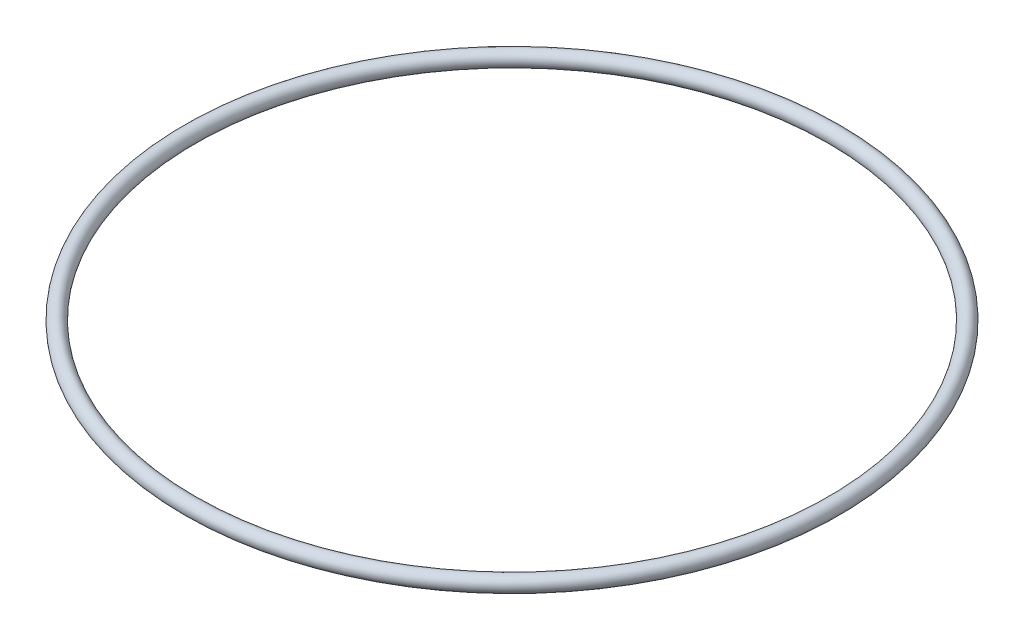
ISO-10303-21;
HEADER;
FILE_DESCRIPTION(('STEP AP214'),'2;1');
FILE_NAME('part.step','',(''),(''),'','','');
FILE_SCHEMA(('AUTOMOTIVE_DESIGN { 1 0 10303 214 1 1 1 1 }'));
ENDSEC;
DATA;
#1=APPLICATION_CONTEXT('core data for automotive mechanical design processes');
#2=APPLICATION_PROTOCOL_DEFINITION('international standard','automotive_design',2000,#1);
#3=PRODUCT_CONTEXT('',#1,'mechanical');
#4=PRODUCT('Part','Part','',(#3));
#5=PRODUCT_RELATED_PRODUCT_CATEGORY('part','',(#4));
#6=PRODUCT_DEFINITION_FORMATION('','',#4);
#7=PRODUCT_DEFINITION_CONTEXT('part definition',#1,'design');
#8=PRODUCT_DEFINITION('design','',#6,#7);
#9=PRODUCT_DEFINITION_SHAPE('','',#8);
#10=(LENGTH_UNIT() NAMED_UNIT(*) SI_UNIT(.MILLI.,.METRE.));
#11=(NAMED_UNIT(*) PLANE_ANGLE_UNIT() SI_UNIT($,.RADIAN.));
#12=(NAMED_UNIT(*) SI_UNIT($,.STERADIAN.) SOLID_ANGLE_UNIT());
#13=UNCERTAINTY_MEASURE_WITH_UNIT(LENGTH_MEASURE(1.E-05),#10,'distance_accuracy_value','');
#14=(GEOMETRIC_REPRESENTATION_CONTEXT(3) GLOBAL_UNCERTAINTY_ASSIGNED_CONTEXT((#13)) GLOBAL_UNIT_ASSIGNED_CONTEXT((#10,
#11,#12)) REPRESENTATION_CONTEXT('',''));
#15=CARTESIAN_POINT('',(0.,0.,0.));
#16=DIRECTION('',(0.,0.,1.));
#17=DIRECTION('',(1.,0.,0.));
#18=AXIS2_PLACEMENT_3D('',#15,#16,#17);
#19=CARTESIAN_POINT('',(0.,0.,0.));
#20=DIRECTION('',(0.,1.,0.));
#21=DIRECTION('',(0.,0.,1.));
#22=AXIS2_PLACEMENT_3D('',#19,#20,#21);
#23=TOROIDAL_SURFACE('',#22,63.5,1.5);
#24=CARTESIAN_POINT('',(0.,0.,65.));
#25=VERTEX_POINT('',#24);
#26=VERTEX_LOOP('',#25);
#27=FACE_BOUND('',#26,.T.);
#28=ADVANCED_FACE('F32',(#27),#23,.T.);
#29=CLOSED_SHELL('',(#28));
#30=MANIFOLD_SOLID_BREP('B2',#29);
#31=ADVANCED_BREP_SHAPE_REPRESENTATION('',(#18,#30),#14);
#32=SHAPE_DEFINITION_REPRESENTATION(#9,#31);
ENDSEC;
END-ISO-10303-21;
